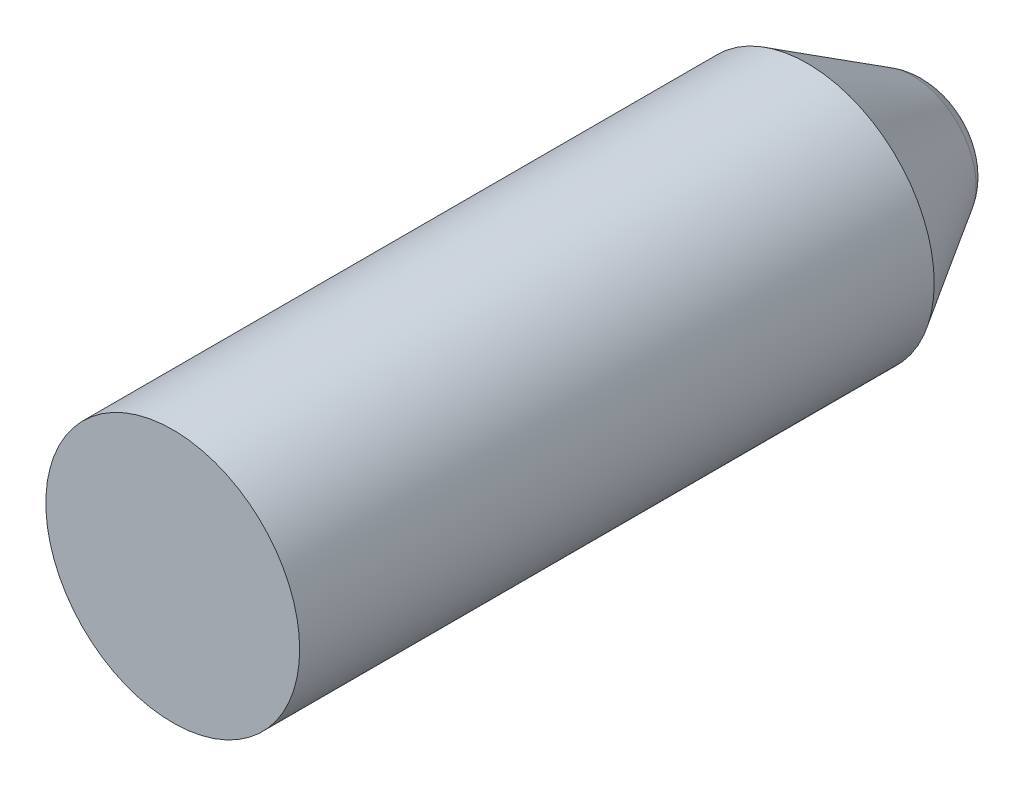
ISO-10303-21;
HEADER;
FILE_DESCRIPTION(('STEP AP214'),'2;1');
FILE_NAME('part.step','',(''),(''),'','','');
FILE_SCHEMA(('AUTOMOTIVE_DESIGN { 1 0 10303 214 1 1 1 1 }'));
ENDSEC;
DATA;
#1=APPLICATION_CONTEXT('core data for automotive mechanical design processes');
#2=APPLICATION_PROTOCOL_DEFINITION('international standard','automotive_design',2000,#1);
#3=PRODUCT_CONTEXT('',#1,'mechanical');
#4=PRODUCT('Part','Part','',(#3));
#5=PRODUCT_RELATED_PRODUCT_CATEGORY('part','',(#4));
#6=PRODUCT_DEFINITION_FORMATION('','',#4);
#7=PRODUCT_DEFINITION_CONTEXT('part definition',#1,'design');
#8=PRODUCT_DEFINITION('design','',#6,#7);
#9=PRODUCT_DEFINITION_SHAPE('','',#8);
#10=(LENGTH_UNIT() NAMED_UNIT(*) SI_UNIT(.MILLI.,.METRE.));
#11=(NAMED_UNIT(*) PLANE_ANGLE_UNIT() SI_UNIT($,.RADIAN.));
#12=(NAMED_UNIT(*) SI_UNIT($,.STERADIAN.) SOLID_ANGLE_UNIT());
#13=UNCERTAINTY_MEASURE_WITH_UNIT(LENGTH_MEASURE(1.E-05),#10,'distance_accuracy_value','');
#14=(GEOMETRIC_REPRESENTATION_CONTEXT(3) GLOBAL_UNCERTAINTY_ASSIGNED_CONTEXT((#13)) GLOBAL_UNIT_ASSIGNED_CONTEXT((#10,
#11,#12)) REPRESENTATION_CONTEXT('',''));
#15=CARTESIAN_POINT('',(0.,0.,0.));
#16=DIRECTION('',(0.,0.,1.));
#17=DIRECTION('',(1.,0.,0.));
#18=AXIS2_PLACEMENT_3D('',#15,#16,#17);
#19=CARTESIAN_POINT('',(0.,0.,0.));
#20=DIRECTION('',(0.,0.,1.));
#21=DIRECTION('',(1.,0.,0.));
#22=AXIS2_PLACEMENT_3D('',#19,#20,#21);
#23=PLANE('',#22);
#24=CARTESIAN_POINT('',(0.,0.,0.));
#25=DIRECTION('',(0.,0.,1.));
#26=DIRECTION('',(1.,0.,0.));
#27=AXIS2_PLACEMENT_3D('',#24,#25,#26);
#28=CIRCLE('',#27,5.);
#29=CARTESIAN_POINT('',(5.,0.,0.));
#30=VERTEX_POINT('',#29);
#31=EDGE_CURVE('E10',#30,#30,#28,.T.);
#32=ORIENTED_EDGE('',*,*,#31,.T.);
#33=EDGE_LOOP('',(#32));
#34=FACE_BOUND('',#33,.T.);
#35=ADVANCED_FACE('F37',(#34),#23,.T.);
#36=CARTESIAN_POINT('',(0.,0.,998.91466628336));
#37=DIRECTION('',(0.,0.,1.));
#38=DIRECTION('',(1.,0.,0.));
#39=AXIS2_PLACEMENT_3D('',#36,#37,#38);
#40=CYLINDRICAL_SURFACE('',#39,5.);
#41=CARTESIAN_POINT('',(0.,0.,-24.9999999999999));
#42=DIRECTION('',(0.,0.,1.));
#43=DIRECTION('',(1.,0.,0.));
#44=AXIS2_PLACEMENT_3D('',#41,#42,#43);
#45=CIRCLE('',#44,5.);
#46=CARTESIAN_POINT('',(5.,0.,-24.9999999999999));
#47=VERTEX_POINT('',#46);
#48=EDGE_CURVE('E44',#47,#47,#45,.T.);
#49=ORIENTED_EDGE('',*,*,#48,.T.);
#50=EDGE_LOOP('',(#49));
#51=FACE_BOUND('',#50,.T.);
#52=ORIENTED_EDGE('',*,*,#31,.F.);
#53=EDGE_LOOP('',(#52));
#54=FACE_BOUND('',#53,.T.);
#55=ADVANCED_FACE('F73',(#51,#54),#40,.T.);
#56=CARTESIAN_POINT('',(0.,0.,-24.9999999999999));
#57=DIRECTION('',(0.,0.,1.));
#58=DIRECTION('',(1.,0.,0.));
#59=AXIS2_PLACEMENT_3D('',#56,#57,#58);
#60=CONICAL_SURFACE('',#59,5.,0.541951837798487);
#61=CARTESIAN_POINT('',(0.,0.,-29.1522314447696));
#62=DIRECTION('',(0.,0.,1.));
#63=DIRECTION('',(1.,0.,0.));
#64=AXIS2_PLACEMENT_3D('',#61,#62,#63);
#65=CIRCLE('',#64,2.5);
#66=CARTESIAN_POINT('',(2.5,0.,-29.1522314447696));
#67=VERTEX_POINT('',#66);
#68=EDGE_CURVE('E49',#67,#67,#65,.T.);
#69=ORIENTED_EDGE('',*,*,#68,.T.);
#70=EDGE_LOOP('',(#69));
#71=FACE_BOUND('',#70,.T.);
#72=ORIENTED_EDGE('',*,*,#48,.F.);
#73=EDGE_LOOP('',(#72));
#74=FACE_BOUND('',#73,.T.);
#75=ADVANCED_FACE('F70',(#71,#74),#60,.T.);
#76=CARTESIAN_POINT('',(0.,0.,-28.2491025970934));
#77=DIRECTION('',(0.,0.,1.));
#78=DIRECTION('',(1.,0.,0.));
#79=AXIS2_PLACEMENT_3D('',#76,#77,#78);
#80=DEGENERATE_TOROIDAL_SURFACE('',#79,0.999999999999998,1.75089740290659,.T.);
#81=CARTESIAN_POINT('',(0.,0.,-30.));
#82=DIRECTION('',(0.,0.,1.));
#83=DIRECTION('',(1.,0.,0.));
#84=AXIS2_PLACEMENT_3D('',#81,#82,#83);
#85=CIRCLE('',#84,0.999999999999999);
#86=CARTESIAN_POINT('',(0.999999999999999,0.,-30.));
#87=VERTEX_POINT('',#86);
#88=EDGE_CURVE('E54',#87,#87,#85,.T.);
#89=ORIENTED_EDGE('',*,*,#88,.T.);
#90=EDGE_LOOP('',(#89));
#91=FACE_BOUND('',#90,.T.);
#92=ORIENTED_EDGE('',*,*,#68,.F.);
#93=EDGE_LOOP('',(#92));
#94=FACE_BOUND('',#93,.T.);
#95=ADVANCED_FACE('F61',(#91,#94),#80,.T.);
#96=CARTESIAN_POINT('',(0.999999999999999,0.,-30.));
#97=DIRECTION('',(0.,0.,-1.));
#98=DIRECTION('',(-1.,0.,0.));
#99=AXIS2_PLACEMENT_3D('',#96,#97,#98);
#100=PLANE('',#99);
#101=ORIENTED_EDGE('',*,*,#88,.F.);
#102=EDGE_LOOP('',(#101));
#103=FACE_BOUND('',#102,.T.);
#104=ADVANCED_FACE('F64',(#103),#100,.T.);
#105=CLOSED_SHELL('',(#35,#55,#75,#95,#104));
#106=MANIFOLD_SOLID_BREP('B2',#105);
#107=ADVANCED_BREP_SHAPE_REPRESENTATION('',(#18,#106),#14);
#108=SHAPE_DEFINITION_REPRESENTATION(#9,#107);
ENDSEC;
END-ISO-10303-21;
